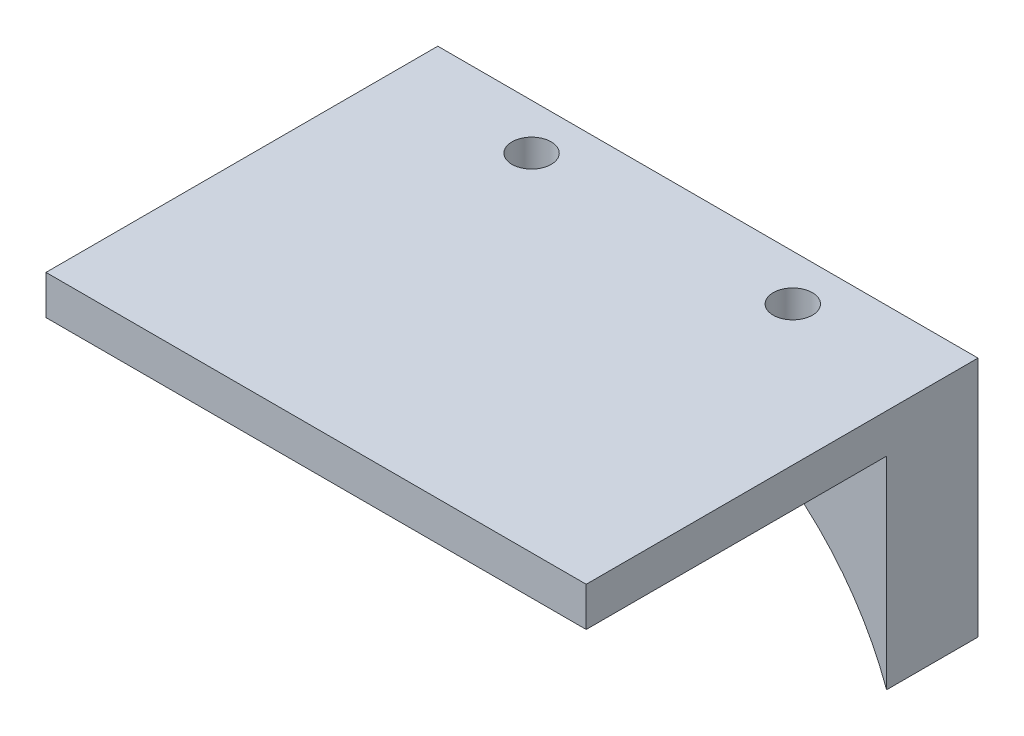
ISO-10303-21;
HEADER;
FILE_DESCRIPTION(('STEP AP214'),'2;1');
FILE_NAME('part.step','',(''),(''),'','','');
FILE_SCHEMA(('AUTOMOTIVE_DESIGN { 1 0 10303 214 1 1 1 1 }'));
ENDSEC;
DATA;
#1=APPLICATION_CONTEXT('core data for automotive mechanical design processes');
#2=APPLICATION_PROTOCOL_DEFINITION('international standard','automotive_design',2000,#1);
#3=PRODUCT_CONTEXT('',#1,'mechanical');
#4=PRODUCT('Part','Part','',(#3));
#5=PRODUCT_RELATED_PRODUCT_CATEGORY('part','',(#4));
#6=PRODUCT_DEFINITION_FORMATION('','',#4);
#7=PRODUCT_DEFINITION_CONTEXT('part definition',#1,'design');
#8=PRODUCT_DEFINITION('design','',#6,#7);
#9=PRODUCT_DEFINITION_SHAPE('','',#8);
#10=(LENGTH_UNIT() NAMED_UNIT(*) SI_UNIT(.MILLI.,.METRE.));
#11=(NAMED_UNIT(*) PLANE_ANGLE_UNIT() SI_UNIT($,.RADIAN.));
#12=(NAMED_UNIT(*) SI_UNIT($,.STERADIAN.) SOLID_ANGLE_UNIT());
#13=UNCERTAINTY_MEASURE_WITH_UNIT(LENGTH_MEASURE(1.E-05),#10,'distance_accuracy_value','');
#14=(GEOMETRIC_REPRESENTATION_CONTEXT(3) GLOBAL_UNCERTAINTY_ASSIGNED_CONTEXT((#13)) GLOBAL_UNIT_ASSIGNED_CONTEXT((#10,
#11,#12)) REPRESENTATION_CONTEXT('',''));
#15=CARTESIAN_POINT('',(0.,0.,0.));
#16=DIRECTION('',(0.,0.,1.));
#17=DIRECTION('',(1.,0.,0.));
#18=AXIS2_PLACEMENT_3D('',#15,#16,#17);
#19=CARTESIAN_POINT('',(-20.6821178799464,0.,7.));
#20=DIRECTION('',(1.,0.,0.));
#21=DIRECTION('',(0.,1.,0.));
#22=AXIS2_PLACEMENT_3D('',#19,#20,#21);
#23=PLANE('',#22);
#24=DIRECTION('',(0.,-1.,0.));
#25=VECTOR('',#24,1.);
#26=CARTESIAN_POINT('',(-20.6821178799464,0.,0.));
#27=LINE('',#26,#25);
#28=CARTESIAN_POINT('',(-20.6821178799464,26.,0.));
#29=VERTEX_POINT('',#28);
#30=CARTESIAN_POINT('',(-20.6821178799464,7.5,0.));
#31=VERTEX_POINT('',#30);
#32=EDGE_CURVE('E99',#29,#31,#27,.T.);
#33=ORIENTED_EDGE('',*,*,#32,.T.);
#34=DIRECTION('',(0.,0.,-1.));
#35=VECTOR('',#34,1.);
#36=CARTESIAN_POINT('',(-20.6821178799464,7.5,7.));
#37=LINE('',#36,#35);
#38=CARTESIAN_POINT('',(-20.6821178799464,7.5,7.));
#39=VERTEX_POINT('',#38);
#40=EDGE_CURVE('E11',#39,#31,#37,.T.);
#41=ORIENTED_EDGE('',*,*,#40,.F.);
#42=DIRECTION('',(0.,-1.,0.));
#43=VECTOR('',#42,1.);
#44=CARTESIAN_POINT('',(-20.6821178799464,0.,7.));
#45=LINE('',#44,#43);
#46=CARTESIAN_POINT('',(-20.6821178799464,23.,7.));
#47=VERTEX_POINT('',#46);
#48=EDGE_CURVE('E76',#47,#39,#45,.T.);
#49=ORIENTED_EDGE('',*,*,#48,.F.);
#50=DIRECTION('',(0.,0.,1.));
#51=VECTOR('',#50,1.);
#52=CARTESIAN_POINT('',(-20.6821178799464,23.,7.));
#53=LINE('',#52,#51);
#54=CARTESIAN_POINT('',(-20.6821178799464,23.,30.));
#55=VERTEX_POINT('',#54);
#56=EDGE_CURVE('E66',#47,#55,#53,.T.);
#57=ORIENTED_EDGE('',*,*,#56,.T.);
#58=DIRECTION('',(0.,1.,0.));
#59=VECTOR('',#58,1.);
#60=CARTESIAN_POINT('',(-20.6821178799464,23.,30.));
#61=LINE('',#60,#59);
#62=CARTESIAN_POINT('',(-20.6821178799464,26.,30.));
#63=VERTEX_POINT('',#62);
#64=EDGE_CURVE('E121',#55,#63,#61,.T.);
#65=ORIENTED_EDGE('',*,*,#64,.T.);
#66=DIRECTION('',(0.,0.,-1.));
#67=VECTOR('',#66,1.);
#68=CARTESIAN_POINT('',(-20.6821178799464,26.,7.));
#69=LINE('',#68,#67);
#70=EDGE_CURVE('E50',#63,#29,#69,.T.);
#71=ORIENTED_EDGE('',*,*,#70,.T.);
#72=EDGE_LOOP('',(#33,#41,#49,#57,#65,#71));
#73=FACE_BOUND('',#72,.T.);
#74=ADVANCED_FACE('F47',(#73),#23,.F.);
#75=CARTESIAN_POINT('',(0.,0.,7.));
#76=DIRECTION('',(0.,0.,-1.));
#77=DIRECTION('',(-1.,0.,0.));
#78=AXIS2_PLACEMENT_3D('',#75,#76,#77);
#79=CYLINDRICAL_SURFACE('',#78,22.);
#80=CARTESIAN_POINT('',(-10.,19.5959179422654,5.));
#81=CARTESIAN_POINT('',(-9.90978152514876,19.6419563102293,4.99999736238158));
#82=CARTESIAN_POINT('',(-9.81917891634582,19.6873998083297,4.99184940393027));
#83=CARTESIAN_POINT('',(-9.63971085702008,19.7758946414396,4.95894705459985));
#84=CARTESIAN_POINT('',(-9.55084740153323,19.8189433228702,4.93417462480059));
#85=CARTESIAN_POINT('',(-9.37743008946667,19.9015842578455,4.86786229874881));
#86=CARTESIAN_POINT('',(-9.29289125443842,19.9411647646407,4.82626790922957));
#87=CARTESIAN_POINT('',(-9.13165632109446,20.0155123573942,4.72675964130772));
#88=CARTESIAN_POINT('',(-9.05495524380931,20.0502825041859,4.66885621223288));
#89=CARTESIAN_POINT('',(-8.91824003878005,20.1114440991231,4.54295685372655));
#90=CARTESIAN_POINT('',(-8.85739722903451,20.1382736550078,4.47607572402348));
#91=CARTESIAN_POINT('',(-8.74799366832809,20.1860392513366,4.33108980924696));
#92=CARTESIAN_POINT('',(-8.69942519050644,20.2069790004378,4.25299213395505));
#93=CARTESIAN_POINT('',(-8.62089437557547,20.2405987518945,4.09585453703473));
#94=CARTESIAN_POINT('',(-8.5896065451536,20.2538727328897,4.01760265963384));
#95=CARTESIAN_POINT('',(-8.54048687796579,20.2746345100014,3.85626017210017));
#96=CARTESIAN_POINT('',(-8.5226489433493,20.2821249282794,3.77317177315456));
#97=CARTESIAN_POINT('',(-8.50195271404499,20.2908086511677,3.61027777566217));
#98=CARTESIAN_POINT('',(-8.49820682374747,20.2923751155959,3.53060354688905));
#99=CARTESIAN_POINT('',(-8.50338278911663,20.2902067472983,3.37174835282467));
#100=CARTESIAN_POINT('',(-8.51230240751398,20.2864728508425,3.29256730289829));
#101=CARTESIAN_POINT('',(-8.54212586960535,20.2739324292548,3.13856577057188));
#102=CARTESIAN_POINT('',(-8.56278881377846,20.2652278546743,3.06368997966085));
#103=CARTESIAN_POINT('',(-8.61509374975968,20.243047233825,2.91863955551494));
#104=CARTESIAN_POINT('',(-8.64673632020225,20.2295709360821,2.84846517028022));
#105=CARTESIAN_POINT('',(-8.72069024831087,20.1978021535423,2.71293815000999));
#106=CARTESIAN_POINT('',(-8.7632364645397,20.1794031941079,2.64773901269677));
#107=CARTESIAN_POINT('',(-8.85707813153295,20.1383908122469,2.52548859307085));
#108=CARTESIAN_POINT('',(-8.90837550263779,20.1157764647006,2.46843910416428));
#109=CARTESIAN_POINT('',(-9.02140561278876,20.065350464365,2.36033662739927));
#110=CARTESIAN_POINT('',(-9.08358259388585,20.0373067624347,2.30985727263483));
#111=CARTESIAN_POINT('',(-9.21395550953788,19.9776916676101,2.21999627519931));
#112=CARTESIAN_POINT('',(-9.28215346276573,19.9461190906265,2.18061837324911));
#113=CARTESIAN_POINT('',(-9.42873925432424,19.8772727310227,2.11046175072849));
#114=CARTESIAN_POINT('',(-9.50749910829111,19.8397421692448,2.08071302277387));
#115=CARTESIAN_POINT('',(-9.66770729643166,19.7621701500498,2.03489526815232));
#116=CARTESIAN_POINT('',(-9.74915670322921,19.722127684987,2.01883176945656));
#117=CARTESIAN_POINT('',(-9.92016664868305,19.6367059433912,1.99943924006038));
#118=CARTESIAN_POINT('',(-10.0097956449172,19.5911712143673,1.99739071645122));
#119=CARTESIAN_POINT('',(-10.1876107603225,19.4992978863367,2.00911120992637));
#120=CARTESIAN_POINT('',(-10.2757962849672,19.4529589715303,2.02288658604907));
#121=CARTESIAN_POINT('',(-10.4537344058986,19.3579491628165,2.06716273570546));
#122=CARTESIAN_POINT('',(-10.5432669374332,19.3093039622513,2.09861176989203));
#123=CARTESIAN_POINT('',(-10.7157705162537,19.2141087441376,2.17837065928728));
#124=CARTESIAN_POINT('',(-10.7987397669848,19.1675593017493,2.22668511158107));
#125=CARTESIAN_POINT('',(-10.954105893637,19.0791883710415,2.33866205546532));
#126=CARTESIAN_POINT('',(-11.0266491952284,19.0373037629019,2.40206978601451));
#127=CARTESIAN_POINT('',(-11.1596583741355,18.9596402777455,2.5436519350255));
#128=CARTESIAN_POINT('',(-11.2201341532493,18.9238563984205,2.62181414360964));
#129=CARTESIAN_POINT('',(-11.3197081485585,18.8644427393457,2.78152502857059));
#130=CARTESIAN_POINT('',(-11.3604450713667,18.839898973905,2.8617058391134));
#131=CARTESIAN_POINT('',(-11.427302979191,18.7994227368029,3.02993460573044));
#132=CARTESIAN_POINT('',(-11.4534460170684,18.7834772734706,3.1179704572465));
#133=CARTESIAN_POINT('',(-11.4865476532932,18.7632496363494,3.28484785170936));
#134=CARTESIAN_POINT('',(-11.4958079953846,18.757569283433,3.36306891781141));
#135=CARTESIAN_POINT('',(-11.5019187481538,18.7538231823631,3.52016472520426));
#136=CARTESIAN_POINT('',(-11.4987753626677,18.7557536275999,3.59903912003223));
#137=CARTESIAN_POINT('',(-11.4810346094527,18.7666175163043,3.74848163827428));
#138=CARTESIAN_POINT('',(-11.467379061251,18.7749750730913,3.81920750942459));
#139=CARTESIAN_POINT('',(-11.4304348725199,18.7974898056612,3.9571135616991));
#140=CARTESIAN_POINT('',(-11.4071454376562,18.8116474596735,4.02429344993438));
#141=CARTESIAN_POINT('',(-11.3509332830635,18.8456208138257,4.155964308502));
#142=CARTESIAN_POINT('',(-11.3176933643722,18.8656221956739,4.22027085995334));
#143=CARTESIAN_POINT('',(-11.243211641217,18.9101050022192,4.34234411379878));
#144=CARTESIAN_POINT('',(-11.2019671150525,18.9345879505625,4.40010858116577));
#145=CARTESIAN_POINT('',(-11.1075240582012,18.9901617285196,4.51465439177608));
#146=CARTESIAN_POINT('',(-11.0534922979827,19.0216902296084,4.57053492582376));
#147=CARTESIAN_POINT('',(-10.9386259266175,19.0879769954196,4.67255780313583));
#148=CARTESIAN_POINT('',(-10.8777860990515,19.1227377332237,4.7186925998619));
#149=CARTESIAN_POINT('',(-10.7419556858969,19.199408144623,4.8064898143647));
#150=CARTESIAN_POINT('',(-10.6661726999431,19.241640758108,4.8466450707701));
#151=CARTESIAN_POINT('',(-10.5096796473028,19.3275603922826,4.91331349078497));
#152=CARTESIAN_POINT('',(-10.4289727099257,19.3712464813832,4.93983521990535));
#153=CARTESIAN_POINT('',(-10.2900250760151,19.4452957906227,4.97284902816357));
#154=CARTESIAN_POINT('',(-10.2325876930006,19.4755849207573,4.98300310301268));
#155=CARTESIAN_POINT('',(-10.116820741086,19.5359720384731,4.99657971114193));
#156=CARTESIAN_POINT('',(-10.0584911017303,19.5660700106914,5.00000171004007));
#157=CARTESIAN_POINT('',(-10.,19.5959179422654,5.));
#158=B_SPLINE_CURVE_WITH_KNOTS('',3,(#80,#81,#82,#83,#84,#85,#86,#87,#88,#89,#90,#91,#92,#93,
#94,#95,#96,#97,#98,#99,#100,#101,#102,#103,#104,#105,#106,#107,#108,#109,#110,#111,#112,#113,
#114,#115,#116,#117,#118,#119,#120,#121,#122,#123,#124,#125,#126,#127,#128,#129,#130,#131,#132,
#133,#134,#135,#136,#137,#138,#139,#140,#141,#142,#143,#144,#145,#146,#147,#148,#149,#150,#151,
#152,#153,#154,#155,#156,#157),.UNSPECIFIED.,.T.,.F.,(4,2,2,2,2,2,2,2,2,2,2,2,2,2,2,2,2,2,2,2,2,
2,2,2,2,2,2,2,2,2,2,2,2,2,2,2,2,2,4),(0.,0.303635344412006,0.60760069203885,0.91255869828461,
1.21732175831144,1.49870844047222,1.77991754211745,2.03452427827129,2.28901551249633,
2.5271799553692,2.76530233347126,2.99870766866339,3.23212530635902,3.47106938315027,
3.71006596107925,3.96355940555265,4.21713816480015,4.49251189572451,4.76799680763363,
5.06835098421232,5.36882590423246,5.68721628737808,6.00569352351833,6.319135029754,
6.63231827969585,6.91030355411244,7.18786761915147,7.42349539142968,7.65900532729253,
7.87556844887237,8.09214943009943,8.31654322198658,8.54101344561742,8.79166988751047,
9.04251971756746,9.32815247551923,9.61360555950452,9.81044502345899,10.0073001116014),.UNSPECIFIED.);
#159=CARTESIAN_POINT('',(-10.,19.5959179422654,5.));
#160=VERTEX_POINT('',#159);
#161=EDGE_CURVE('E146',#160,#160,#158,.T.);
#162=ORIENTED_EDGE('',*,*,#161,.T.);
#163=EDGE_LOOP('',(#162));
#164=FACE_BOUND('',#163,.T.);
#165=CARTESIAN_POINT('',(10.,19.5959179422654,5.));
#166=CARTESIAN_POINT('',(10.0945599144638,19.5476617233591,4.99999722867831));
#167=CARTESIAN_POINT('',(10.1888572493769,19.4986700594063,4.99104357880452));
#168=CARTESIAN_POINT('',(10.3742633681053,19.4006624621111,4.95563170880031));
#169=CARTESIAN_POINT('',(10.4653657042736,19.3516466617613,4.92914002111119));
#170=CARTESIAN_POINT('',(10.641809902766,19.2551809453936,4.85907843784859));
#171=CARTESIAN_POINT('',(10.7271465496634,19.207732466428,4.81549331637345));
#172=CARTESIAN_POINT('',(10.8892471625405,19.1163007619247,4.71181184394788));
#173=CARTESIAN_POINT('',(10.9660146281444,19.0723161239436,4.65172226831329));
#174=CARTESIAN_POINT('',(11.1045670032718,18.9919642538297,4.51915630179802));
#175=CARTESIAN_POINT('',(11.166893103392,18.955333217493,4.44741030652796));
#176=CARTESIAN_POINT('',(11.2779906894623,18.8894443812978,4.29113601460036));
#177=CARTESIAN_POINT('',(11.3267786463404,18.8601776259034,4.20662344530385));
#178=CARTESIAN_POINT('',(11.4021082164994,18.8147177222607,4.03971394909045));
#179=CARTESIAN_POINT('',(11.4307856745851,18.7972806362595,3.95862243052143));
#180=CARTESIAN_POINT('',(11.473935597678,18.7709738289548,3.79144049500902));
#181=CARTESIAN_POINT('',(11.4884253986605,18.762093652129,3.70535631527517));
#182=CARTESIAN_POINT('',(11.5012560388302,18.7542301507228,3.54352980533156));
#183=CARTESIAN_POINT('',(11.501543130853,18.7540540723857,3.46799269126093));
#184=CARTESIAN_POINT('',(11.4908170032419,18.7606280602526,3.31804275463277));
#185=CARTESIAN_POINT('',(11.4798063057587,18.7673765805893,3.24362968490272));
#186=CARTESIAN_POINT('',(11.4477273067475,18.7869601026889,3.1009660127203));
#187=CARTESIAN_POINT('',(11.4270661761699,18.7995485714221,3.03258831823079));
#188=CARTESIAN_POINT('',(11.3767972435944,18.8300117919057,2.90047685497942));
#189=CARTESIAN_POINT('',(11.3471876617407,18.847887595297,2.8367440132162));
#190=CARTESIAN_POINT('',(11.2777559119676,18.88952004037,2.71077685880415));
#191=CARTESIAN_POINT('',(11.237358281522,18.913603904251,2.64896957122243));
#192=CARTESIAN_POINT('',(11.1489901201406,18.9658285788209,2.53297066298637));
#193=CARTESIAN_POINT('',(11.1010161200743,18.993971247474,2.47878255265547));
#194=CARTESIAN_POINT('',(10.9920906469071,19.057240180328,2.37203339484086));
#195=CARTESIAN_POINT('',(10.9302622094075,19.0927981313524,2.32062356553425));
#196=CARTESIAN_POINT('',(10.8003311136826,19.1665969741016,2.2288567430032));
#197=CARTESIAN_POINT('',(10.7322251078219,19.2048392946964,2.18850569319198));
#198=CARTESIAN_POINT('',(10.5820707839074,19.2880288364449,2.11469426838266));
#199=CARTESIAN_POINT('',(10.4993631038712,19.3331995594281,2.08282143844746));
#200=CARTESIAN_POINT('',(10.3299809356528,19.42423104289,2.03409193960817));
#201=CARTESIAN_POINT('',(10.2433046640021,19.4700921072661,2.01724209300531));
#202=CARTESIAN_POINT('',(10.0617685278243,19.5645598069504,1.99830328870443));
#203=CARTESIAN_POINT('',(9.96676664594288,19.6131282984705,1.99735587016253));
#204=CARTESIAN_POINT('',(9.77727669968518,19.7082749364856,2.01358304125106));
#205=CARTESIAN_POINT('',(9.68278867144391,19.7548529445467,2.03075888918907));
#206=CARTESIAN_POINT('',(9.49877122419144,19.8439824220575,2.08303979599528));
#207=CARTESIAN_POINT('',(9.40918809267238,19.8865845494401,2.11786683399746));
#208=CARTESIAN_POINT('',(9.23675816080716,19.9672570259774,2.20509404306701));
#209=CARTESIAN_POINT('',(9.15390799719161,20.0053296421898,2.25748537250088));
#210=CARTESIAN_POINT('',(9.00488701415406,20.072821611278,2.37396488812834));
#211=CARTESIAN_POINT('',(8.93790750439065,20.1026930364634,2.4367541013189));
#212=CARTESIAN_POINT('',(8.81561712774017,20.1566209560408,2.57494299286383));
#213=CARTESIAN_POINT('',(8.76029808136051,20.180681528324,2.65033376456506));
#214=CARTESIAN_POINT('',(8.66879851652325,20.2201429080683,2.80352955653336));
#215=CARTESIAN_POINT('',(8.63127365750027,20.2361613180168,2.88037382602851));
#216=CARTESIAN_POINT('',(8.56964863723025,20.2623358421583,3.04019854264044));
#217=CARTESIAN_POINT('',(8.54554163798451,20.2724949424636,3.12317583977948));
#218=CARTESIAN_POINT('',(8.51313186799729,20.2861251032923,3.28636939862125));
#219=CARTESIAN_POINT('',(8.50380813858903,20.2900284378901,3.36634827933826));
#220=CARTESIAN_POINT('',(8.49809391237988,20.2924225313826,3.52684025069277));
#221=CARTESIAN_POINT('',(8.50170042444708,20.2909145420702,3.60735321348098));
#222=CARTESIAN_POINT('',(8.52138752782426,20.2826541573358,3.76413035625952));
#223=CARTESIAN_POINT('',(8.53709750042895,20.2760575718431,3.84044982877843));
#224=CARTESIAN_POINT('',(8.57990584370362,20.2579799340658,3.98920689679245));
#225=CARTESIAN_POINT('',(8.60700439271862,20.2464988052894,4.06164443147642));
#226=CARTESIAN_POINT('',(8.67203145009845,20.218732201181,4.20182514820175));
#227=CARTESIAN_POINT('',(8.71011496689784,20.2023778421919,4.26948253614451));
#228=CARTESIAN_POINT('',(8.79554403590597,20.1653308230918,4.39732968806825));
#229=CARTESIAN_POINT('',(8.84289086562806,20.1446375645703,4.45751842016575));
#230=CARTESIAN_POINT('',(8.94801870597528,20.0981698010822,4.57224408206856));
#231=CARTESIAN_POINT('',(9.00622212835657,20.0721828381015,4.62630703703924));
#232=CARTESIAN_POINT('',(9.12929019153241,20.0165087456157,4.72394522552095));
#233=CARTESIAN_POINT('',(9.19415869937582,19.9868194658863,4.76751432096824));
#234=CARTESIAN_POINT('',(9.33424397597241,19.9218052985254,4.84676225640135));
#235=CARTESIAN_POINT('',(9.40987298300967,19.8862175837769,4.88149438149597));
#236=CARTESIAN_POINT('',(9.56452620558279,19.8122984521189,4.93775072700823));
#237=CARTESIAN_POINT('',(9.64354757838294,19.7739693151942,4.959285783744));
#238=CARTESIAN_POINT('',(9.76912958405098,19.7120961797679,4.98286200422463));
#239=CARTESIAN_POINT('',(9.81522550256718,19.6891851827586,4.98929786427683));
#240=CARTESIAN_POINT('',(9.90756849587035,19.6428805765565,4.99786748647822));
#241=CARTESIAN_POINT('',(9.95381556694314,19.6194869791485,5.00000135355368));
#242=CARTESIAN_POINT('',(10.,19.5959179422654,5.));
#243=B_SPLINE_CURVE_WITH_KNOTS('',3,(#165,#166,#167,#168,#169,#170,#171,#172,#173,#174,#175,
#176,#177,#178,#179,#180,#181,#182,#183,#184,#185,#186,#187,#188,#189,#190,#191,#192,#193,#194,
#195,#196,#197,#198,#199,#200,#201,#202,#203,#204,#205,#206,#207,#208,#209,#210,#211,#212,#213,
#214,#215,#216,#217,#218,#219,#220,#221,#222,#223,#224,#225,#226,#227,#228,#229,#230,#231,#232,
#233,#234,#235,#236,#237,#238,#239,#240,#241,#242),.UNSPECIFIED.,.T.,.F.,(4,2,2,2,2,2,2,2,2,2,2,
2,2,2,2,2,2,2,2,2,2,2,2,2,2,2,2,2,2,2,2,2,2,2,2,2,2,2,4),(0.,0.318295683894512,
0.637200524001361,0.956390074746358,1.27544878892673,1.5792387131842,1.88265740025599,
2.1443776628594,2.40577772747875,2.63124133464281,2.85665461961718,3.07331443338872,
3.290017369401,3.522092901895,3.75427500880395,4.01699235355372,4.27985061705031,
4.57702883267423,4.87434193549776,5.19291283809617,5.51150586068938,5.82522987841004,
6.13879620811845,6.42684279649439,6.71468665073847,6.97432010877928,7.23382113119862,
7.47446900879699,7.71506122130202,7.94856554419171,8.18207352389368,8.41905280952721,
8.6560648002933,8.90574376141591,9.15556841190031,9.42599078179821,9.69619080511277,
9.85165482328841,10.0071150496272),.UNSPECIFIED.);
#244=CARTESIAN_POINT('',(10.,19.5959179422654,5.));
#245=VERTEX_POINT('',#244);
#246=EDGE_CURVE('E163',#245,#245,#243,.T.);
#247=ORIENTED_EDGE('',*,*,#246,.T.);
#248=EDGE_LOOP('',(#247));
#249=FACE_BOUND('',#248,.T.);
#250=CARTESIAN_POINT('',(0.,0.,0.));
#251=DIRECTION('',(0.,0.,-1.));
#252=DIRECTION('',(-1.,0.,0.));
#253=AXIS2_PLACEMENT_3D('',#250,#251,#252);
#254=CIRCLE('',#253,22.);
#255=CARTESIAN_POINT('',(20.6821178799464,7.5,0.));
#256=VERTEX_POINT('',#255);
#257=EDGE_CURVE('E95',#31,#256,#254,.T.);
#258=ORIENTED_EDGE('',*,*,#257,.T.);
#259=DIRECTION('',(0.,0.,-1.));
#260=VECTOR('',#259,1.);
#261=CARTESIAN_POINT('',(20.6821178799464,7.5,7.));
#262=LINE('',#261,#260);
#263=CARTESIAN_POINT('',(20.6821178799464,7.5,7.));
#264=VERTEX_POINT('',#263);
#265=EDGE_CURVE('E56',#264,#256,#262,.T.);
#266=ORIENTED_EDGE('',*,*,#265,.F.);
#267=CARTESIAN_POINT('',(0.,0.,7.));
#268=DIRECTION('',(0.,0.,-1.));
#269=DIRECTION('',(-1.,0.,0.));
#270=AXIS2_PLACEMENT_3D('',#267,#268,#269);
#271=CIRCLE('',#270,22.);
#272=EDGE_CURVE('E108',#39,#264,#271,.T.);
#273=ORIENTED_EDGE('',*,*,#272,.F.);
#274=ORIENTED_EDGE('',*,*,#40,.T.);
#275=EDGE_LOOP('',(#258,#266,#273,#274));
#276=FACE_BOUND('',#275,.T.);
#277=ADVANCED_FACE('F107',(#164,#249,#276),#79,.F.);
#278=CARTESIAN_POINT('',(20.6821178799464,0.,7.));
#279=DIRECTION('',(-1.,0.,0.));
#280=DIRECTION('',(0.,0.,1.));
#281=AXIS2_PLACEMENT_3D('',#278,#279,#280);
#282=PLANE('',#281);
#283=DIRECTION('',(0.,1.,0.));
#284=VECTOR('',#283,1.);
#285=CARTESIAN_POINT('',(20.6821178799464,0.,0.));
#286=LINE('',#285,#284);
#287=CARTESIAN_POINT('',(20.6821178799464,26.,0.));
#288=VERTEX_POINT('',#287);
#289=EDGE_CURVE('E100',#256,#288,#286,.T.);
#290=ORIENTED_EDGE('',*,*,#289,.T.);
#291=DIRECTION('',(0.,0.,-1.));
#292=VECTOR('',#291,1.);
#293=CARTESIAN_POINT('',(20.6821178799464,26.,7.));
#294=LINE('',#293,#292);
#295=CARTESIAN_POINT('',(20.6821178799464,26.,30.));
#296=VERTEX_POINT('',#295);
#297=EDGE_CURVE('E127',#296,#288,#294,.T.);
#298=ORIENTED_EDGE('',*,*,#297,.F.);
#299=DIRECTION('',(0.,1.,0.));
#300=VECTOR('',#299,1.);
#301=CARTESIAN_POINT('',(20.6821178799464,23.,30.));
#302=LINE('',#301,#300);
#303=CARTESIAN_POINT('',(20.6821178799464,23.,30.));
#304=VERTEX_POINT('',#303);
#305=EDGE_CURVE('E115',#304,#296,#302,.T.);
#306=ORIENTED_EDGE('',*,*,#305,.F.);
#307=DIRECTION('',(0.,0.,-1.));
#308=VECTOR('',#307,1.);
#309=CARTESIAN_POINT('',(20.6821178799464,23.,7.));
#310=LINE('',#309,#308);
#311=CARTESIAN_POINT('',(20.6821178799464,23.,7.));
#312=VERTEX_POINT('',#311);
#313=EDGE_CURVE('E149',#304,#312,#310,.T.);
#314=ORIENTED_EDGE('',*,*,#313,.T.);
#315=DIRECTION('',(0.,1.,0.));
#316=VECTOR('',#315,1.);
#317=CARTESIAN_POINT('',(20.6821178799464,0.,7.));
#318=LINE('',#317,#316);
#319=EDGE_CURVE('E135',#264,#312,#318,.T.);
#320=ORIENTED_EDGE('',*,*,#319,.F.);
#321=ORIENTED_EDGE('',*,*,#265,.T.);
#322=EDGE_LOOP('',(#290,#298,#306,#314,#320,#321));
#323=FACE_BOUND('',#322,.T.);
#324=ADVANCED_FACE('F196',(#323),#282,.F.);
#325=CARTESIAN_POINT('',(0.,26.,7.));
#326=DIRECTION('',(0.,-1.,0.));
#327=DIRECTION('',(0.,0.,-1.));
#328=AXIS2_PLACEMENT_3D('',#325,#326,#327);
#329=PLANE('',#328);
#330=CARTESIAN_POINT('',(-10.,26.,3.5));
#331=DIRECTION('',(0.,1.,0.));
#332=DIRECTION('',(0.,0.,1.));
#333=AXIS2_PLACEMENT_3D('',#330,#331,#332);
#334=CIRCLE('',#333,1.5);
#335=CARTESIAN_POINT('',(-10.,26.,5.));
#336=VERTEX_POINT('',#335);
#337=EDGE_CURVE('E206',#336,#336,#334,.T.);
#338=ORIENTED_EDGE('',*,*,#337,.F.);
#339=EDGE_LOOP('',(#338));
#340=FACE_BOUND('',#339,.T.);
#341=CARTESIAN_POINT('',(10.,26.,3.5));
#342=DIRECTION('',(0.,1.,0.));
#343=DIRECTION('',(0.,0.,1.));
#344=AXIS2_PLACEMENT_3D('',#341,#342,#343);
#345=CIRCLE('',#344,1.5);
#346=CARTESIAN_POINT('',(10.,26.,5.));
#347=VERTEX_POINT('',#346);
#348=EDGE_CURVE('E208',#347,#347,#345,.T.);
#349=ORIENTED_EDGE('',*,*,#348,.F.);
#350=EDGE_LOOP('',(#349));
#351=FACE_BOUND('',#350,.T.);
#352=DIRECTION('',(-1.,0.,0.));
#353=VECTOR('',#352,1.);
#354=CARTESIAN_POINT('',(0.,26.,0.));
#355=LINE('',#354,#353);
#356=EDGE_CURVE('E114',#288,#29,#355,.T.);
#357=ORIENTED_EDGE('',*,*,#356,.T.);
#358=ORIENTED_EDGE('',*,*,#70,.F.);
#359=DIRECTION('',(1.,0.,0.));
#360=VECTOR('',#359,1.);
#361=CARTESIAN_POINT('',(-20.6821178799464,26.,30.));
#362=LINE('',#361,#360);
#363=EDGE_CURVE('E144',#63,#296,#362,.T.);
#364=ORIENTED_EDGE('',*,*,#363,.T.);
#365=ORIENTED_EDGE('',*,*,#297,.T.);
#366=EDGE_LOOP('',(#357,#358,#364,#365));
#367=FACE_BOUND('',#366,.T.);
#368=ADVANCED_FACE('F190',(#340,#351,#367),#329,.F.);
#369=CARTESIAN_POINT('',(0.,0.,7.));
#370=DIRECTION('',(0.,0.,-1.));
#371=DIRECTION('',(-1.,0.,0.));
#372=AXIS2_PLACEMENT_3D('',#369,#370,#371);
#373=PLANE('',#372);
#374=ORIENTED_EDGE('',*,*,#319,.T.);
#375=DIRECTION('',(-1.,0.,0.));
#376=VECTOR('',#375,1.);
#377=CARTESIAN_POINT('',(-20.6821178799464,23.,7.));
#378=LINE('',#377,#376);
#379=EDGE_CURVE('E142',#312,#47,#378,.T.);
#380=ORIENTED_EDGE('',*,*,#379,.T.);
#381=ORIENTED_EDGE('',*,*,#48,.T.);
#382=ORIENTED_EDGE('',*,*,#272,.T.);
#383=EDGE_LOOP('',(#374,#380,#381,#382));
#384=FACE_BOUND('',#383,.T.);
#385=ADVANCED_FACE('F188',(#384),#373,.F.);
#386=CARTESIAN_POINT('',(0.,0.,0.));
#387=DIRECTION('',(0.,0.,-1.));
#388=DIRECTION('',(-1.,0.,0.));
#389=AXIS2_PLACEMENT_3D('',#386,#387,#388);
#390=PLANE('',#389);
#391=ORIENTED_EDGE('',*,*,#32,.F.);
#392=ORIENTED_EDGE('',*,*,#356,.F.);
#393=ORIENTED_EDGE('',*,*,#289,.F.);
#394=ORIENTED_EDGE('',*,*,#257,.F.);
#395=EDGE_LOOP('',(#391,#392,#393,#394));
#396=FACE_BOUND('',#395,.T.);
#397=ADVANCED_FACE('F96',(#396),#390,.T.);
#398=CARTESIAN_POINT('',(-20.6821178799464,23.,30.));
#399=DIRECTION('',(0.,0.,1.));
#400=DIRECTION('',(1.,0.,0.));
#401=AXIS2_PLACEMENT_3D('',#398,#399,#400);
#402=PLANE('',#401);
#403=ORIENTED_EDGE('',*,*,#363,.F.);
#404=ORIENTED_EDGE('',*,*,#64,.F.);
#405=DIRECTION('',(1.,0.,0.));
#406=VECTOR('',#405,1.);
#407=CARTESIAN_POINT('',(-20.6821178799464,23.,30.));
#408=LINE('',#407,#406);
#409=EDGE_CURVE('E152',#55,#304,#408,.T.);
#410=ORIENTED_EDGE('',*,*,#409,.T.);
#411=ORIENTED_EDGE('',*,*,#305,.T.);
#412=EDGE_LOOP('',(#403,#404,#410,#411));
#413=FACE_BOUND('',#412,.T.);
#414=ADVANCED_FACE('F184',(#413),#402,.T.);
#415=CARTESIAN_POINT('',(0.,23.,0.));
#416=DIRECTION('',(0.,1.,0.));
#417=DIRECTION('',(0.,0.,1.));
#418=AXIS2_PLACEMENT_3D('',#415,#416,#417);
#419=PLANE('',#418);
#420=ORIENTED_EDGE('',*,*,#56,.F.);
#421=ORIENTED_EDGE('',*,*,#379,.F.);
#422=ORIENTED_EDGE('',*,*,#313,.F.);
#423=ORIENTED_EDGE('',*,*,#409,.F.);
#424=EDGE_LOOP('',(#420,#421,#422,#423));
#425=FACE_BOUND('',#424,.T.);
#426=ADVANCED_FACE('F180',(#425),#419,.F.);
#427=CARTESIAN_POINT('',(10.,-22.,3.5));
#428=DIRECTION('',(0.,1.,0.));
#429=DIRECTION('',(0.,0.,1.));
#430=AXIS2_PLACEMENT_3D('',#427,#428,#429);
#431=CYLINDRICAL_SURFACE('',#430,1.5);
#432=ORIENTED_EDGE('',*,*,#348,.T.);
#433=EDGE_LOOP('',(#432));
#434=FACE_BOUND('',#433,.T.);
#435=ORIENTED_EDGE('',*,*,#246,.F.);
#436=EDGE_LOOP('',(#435));
#437=FACE_BOUND('',#436,.T.);
#438=ADVANCED_FACE('F175',(#434,#437),#431,.F.);
#439=CARTESIAN_POINT('',(-10.,-22.,3.5));
#440=DIRECTION('',(0.,1.,0.));
#441=DIRECTION('',(0.,0.,1.));
#442=AXIS2_PLACEMENT_3D('',#439,#440,#441);
#443=CYLINDRICAL_SURFACE('',#442,1.5);
#444=ORIENTED_EDGE('',*,*,#337,.T.);
#445=EDGE_LOOP('',(#444));
#446=FACE_BOUND('',#445,.T.);
#447=ORIENTED_EDGE('',*,*,#161,.F.);
#448=EDGE_LOOP('',(#447));
#449=FACE_BOUND('',#448,.T.);
#450=ADVANCED_FACE('F172',(#446,#449),#443,.F.);
#451=CLOSED_SHELL('',(#74,#277,#324,#368,#385,#397,#414,#426,#438,#450));
#452=MANIFOLD_SOLID_BREP('B2',#451);
#453=ADVANCED_BREP_SHAPE_REPRESENTATION('',(#18,#452),#14);
#454=SHAPE_DEFINITION_REPRESENTATION(#9,#453);
ENDSEC;
END-ISO-10303-21;
